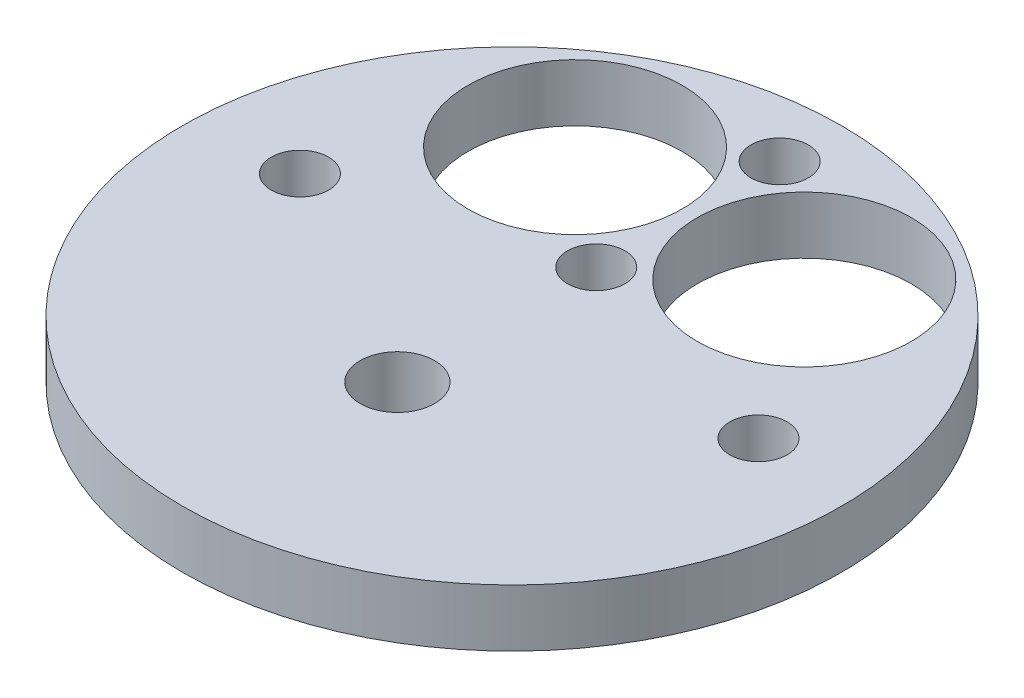
ISO-10303-21;
HEADER;
FILE_DESCRIPTION(('STEP AP214'),'2;1');
FILE_NAME('part.step','',(''),(''),'','','');
FILE_SCHEMA(('AUTOMOTIVE_DESIGN { 1 0 10303 214 1 1 1 1 }'));
ENDSEC;
DATA;
#1=APPLICATION_CONTEXT('core data for automotive mechanical design processes');
#2=APPLICATION_PROTOCOL_DEFINITION('international standard','automotive_design',2000,#1);
#3=PRODUCT_CONTEXT('',#1,'mechanical');
#4=PRODUCT('Part','Part','',(#3));
#5=PRODUCT_RELATED_PRODUCT_CATEGORY('part','',(#4));
#6=PRODUCT_DEFINITION_FORMATION('','',#4);
#7=PRODUCT_DEFINITION_CONTEXT('part definition',#1,'design');
#8=PRODUCT_DEFINITION('design','',#6,#7);
#9=PRODUCT_DEFINITION_SHAPE('','',#8);
#10=(LENGTH_UNIT() NAMED_UNIT(*) SI_UNIT(.MILLI.,.METRE.));
#11=(NAMED_UNIT(*) PLANE_ANGLE_UNIT() SI_UNIT($,.RADIAN.));
#12=(NAMED_UNIT(*) SI_UNIT($,.STERADIAN.) SOLID_ANGLE_UNIT());
#13=UNCERTAINTY_MEASURE_WITH_UNIT(LENGTH_MEASURE(1.E-05),#10,'distance_accuracy_value','');
#14=(GEOMETRIC_REPRESENTATION_CONTEXT(3) GLOBAL_UNCERTAINTY_ASSIGNED_CONTEXT((#13)) GLOBAL_UNIT_ASSIGNED_CONTEXT((#10,
#11,#12)) REPRESENTATION_CONTEXT('',''));
#15=CARTESIAN_POINT('',(0.,0.,0.));
#16=DIRECTION('',(0.,0.,1.));
#17=DIRECTION('',(1.,0.,0.));
#18=AXIS2_PLACEMENT_3D('',#15,#16,#17);
#19=CARTESIAN_POINT('',(0.,6.35,0.));
#20=DIRECTION('',(0.,-1.,0.));
#21=DIRECTION('',(0.,0.,-1.));
#22=AXIS2_PLACEMENT_3D('',#19,#20,#21);
#23=CYLINDRICAL_SURFACE('',#22,36.5125);
#24=CARTESIAN_POINT('',(0.,6.35,0.));
#25=DIRECTION('',(0.,1.,0.));
#26=DIRECTION('',(0.,0.,1.));
#27=AXIS2_PLACEMENT_3D('',#24,#25,#26);
#28=CIRCLE('',#27,36.5125);
#29=CARTESIAN_POINT('',(0.,6.35,36.5125));
#30=VERTEX_POINT('',#29);
#31=EDGE_CURVE('E10',#30,#30,#28,.T.);
#32=ORIENTED_EDGE('',*,*,#31,.F.);
#33=EDGE_LOOP('',(#32));
#34=FACE_BOUND('',#33,.T.);
#35=CARTESIAN_POINT('',(0.,0.,0.));
#36=DIRECTION('',(0.,1.,0.));
#37=DIRECTION('',(0.,0.,1.));
#38=AXIS2_PLACEMENT_3D('',#35,#36,#37);
#39=CIRCLE('',#38,36.5125);
#40=CARTESIAN_POINT('',(0.,0.,36.5125));
#41=VERTEX_POINT('',#40);
#42=EDGE_CURVE('E44',#41,#41,#39,.T.);
#43=ORIENTED_EDGE('',*,*,#42,.T.);
#44=EDGE_LOOP('',(#43));
#45=FACE_BOUND('',#44,.T.);
#46=ADVANCED_FACE('F37',(#34,#45),#23,.T.);
#47=CARTESIAN_POINT('',(0.,6.35,0.));
#48=DIRECTION('',(0.,1.,0.));
#49=DIRECTION('',(0.,0.,1.));
#50=AXIS2_PLACEMENT_3D('',#47,#48,#49);
#51=PLANE('',#50);
#52=CARTESIAN_POINT('',(0.,6.35,12.7));
#53=DIRECTION('',(0.,1.,0.));
#54=DIRECTION('',(0.,0.,1.));
#55=AXIS2_PLACEMENT_3D('',#52,#53,#54);
#56=CIRCLE('',#55,4.1275);
#57=CARTESIAN_POINT('',(0.,6.35,16.8275));
#58=VERTEX_POINT('',#57);
#59=EDGE_CURVE('E81',#58,#58,#56,.T.);
#60=ORIENTED_EDGE('',*,*,#59,.F.);
#61=EDGE_LOOP('',(#60));
#62=FACE_BOUND('',#61,.T.);
#63=CARTESIAN_POINT('',(25.4,6.35,-1.905));
#64=DIRECTION('',(0.,1.,0.));
#65=DIRECTION('',(0.,0.,1.));
#66=AXIS2_PLACEMENT_3D('',#63,#64,#65);
#67=CIRCLE('',#66,3.175);
#68=CARTESIAN_POINT('',(25.4,6.35,1.27));
#69=VERTEX_POINT('',#68);
#70=EDGE_CURVE('E67',#69,#69,#67,.T.);
#71=ORIENTED_EDGE('',*,*,#70,.F.);
#72=EDGE_LOOP('',(#71));
#73=FACE_BOUND('',#72,.T.);
#74=CARTESIAN_POINT('',(-25.4,6.35,-1.905));
#75=DIRECTION('',(0.,1.,0.));
#76=DIRECTION('',(0.,0.,-1.));
#77=AXIS2_PLACEMENT_3D('',#74,#75,#76);
#78=CIRCLE('',#77,3.175);
#79=CARTESIAN_POINT('',(-25.4,6.35,-5.08));
#80=VERTEX_POINT('',#79);
#81=EDGE_CURVE('E73',#80,#80,#78,.T.);
#82=ORIENTED_EDGE('',*,*,#81,.F.);
#83=EDGE_LOOP('',(#82));
#84=FACE_BOUND('',#83,.T.);
#85=CARTESIAN_POINT('',(0.,6.35,-29.6540115119919));
#86=DIRECTION('',(0.,1.,0.));
#87=DIRECTION('',(0.,0.,1.));
#88=AXIS2_PLACEMENT_3D('',#85,#86,#87);
#89=CIRCLE('',#88,3.175);
#90=CARTESIAN_POINT('',(0.,6.35,-26.4790115119919));
#91=VERTEX_POINT('',#90);
#92=EDGE_CURVE('E86',#91,#91,#89,.T.);
#93=ORIENTED_EDGE('',*,*,#92,.F.);
#94=EDGE_LOOP('',(#93));
#95=FACE_BOUND('',#94,.T.);
#96=CARTESIAN_POINT('',(12.7,6.35,-19.685));
#97=DIRECTION('',(0.,1.,0.));
#98=DIRECTION('',(0.,0.,1.));
#99=AXIS2_PLACEMENT_3D('',#96,#97,#98);
#100=CIRCLE('',#99,11.8745);
#101=CARTESIAN_POINT('',(12.7,6.35,-7.8105));
#102=VERTEX_POINT('',#101);
#103=EDGE_CURVE('E88',#102,#102,#100,.T.);
#104=ORIENTED_EDGE('',*,*,#103,.F.);
#105=EDGE_LOOP('',(#104));
#106=FACE_BOUND('',#105,.T.);
#107=CARTESIAN_POINT('',(0.,6.35,-9.33401151199186));
#108=DIRECTION('',(0.,1.,0.));
#109=DIRECTION('',(0.,0.,1.));
#110=AXIS2_PLACEMENT_3D('',#107,#108,#109);
#111=CIRCLE('',#110,3.175);
#112=CARTESIAN_POINT('',(0.,6.35,-6.15901151199185));
#113=VERTEX_POINT('',#112);
#114=EDGE_CURVE('E71',#113,#113,#111,.T.);
#115=ORIENTED_EDGE('',*,*,#114,.F.);
#116=EDGE_LOOP('',(#115));
#117=FACE_BOUND('',#116,.T.);
#118=CARTESIAN_POINT('',(-12.7,6.35,-19.685));
#119=DIRECTION('',(0.,1.,0.));
#120=DIRECTION('',(0.,0.,1.));
#121=AXIS2_PLACEMENT_3D('',#118,#119,#120);
#122=CIRCLE('',#121,11.8745);
#123=CARTESIAN_POINT('',(-12.7,6.35,-7.8105));
#124=VERTEX_POINT('',#123);
#125=EDGE_CURVE('E52',#124,#124,#122,.T.);
#126=ORIENTED_EDGE('',*,*,#125,.F.);
#127=EDGE_LOOP('',(#126));
#128=FACE_BOUND('',#127,.T.);
#129=ORIENTED_EDGE('',*,*,#31,.T.);
#130=EDGE_LOOP('',(#129));
#131=FACE_BOUND('',#130,.T.);
#132=ADVANCED_FACE('F98',(#62,#73,#84,#95,#106,#117,#128,#131),#51,.T.);
#133=CARTESIAN_POINT('',(0.,0.,0.));
#134=DIRECTION('',(0.,1.,0.));
#135=DIRECTION('',(0.,0.,1.));
#136=AXIS2_PLACEMENT_3D('',#133,#134,#135);
#137=PLANE('',#136);
#138=CARTESIAN_POINT('',(0.,0.,12.7));
#139=DIRECTION('',(0.,1.,0.));
#140=DIRECTION('',(0.,0.,1.));
#141=AXIS2_PLACEMENT_3D('',#138,#139,#140);
#142=CIRCLE('',#141,4.1275);
#143=CARTESIAN_POINT('',(0.,0.,16.8275));
#144=VERTEX_POINT('',#143);
#145=EDGE_CURVE('E78',#144,#144,#142,.T.);
#146=ORIENTED_EDGE('',*,*,#145,.T.);
#147=EDGE_LOOP('',(#146));
#148=FACE_BOUND('',#147,.T.);
#149=CARTESIAN_POINT('',(25.4,0.,-1.905));
#150=DIRECTION('',(0.,1.,0.));
#151=DIRECTION('',(0.,0.,1.));
#152=AXIS2_PLACEMENT_3D('',#149,#150,#151);
#153=CIRCLE('',#152,3.175);
#154=CARTESIAN_POINT('',(25.4,0.,1.27));
#155=VERTEX_POINT('',#154);
#156=EDGE_CURVE('E40',#155,#155,#153,.T.);
#157=ORIENTED_EDGE('',*,*,#156,.T.);
#158=EDGE_LOOP('',(#157));
#159=FACE_BOUND('',#158,.T.);
#160=CARTESIAN_POINT('',(-25.4,0.,-1.905));
#161=DIRECTION('',(0.,1.,0.));
#162=DIRECTION('',(0.,0.,1.));
#163=AXIS2_PLACEMENT_3D('',#160,#161,#162);
#164=CIRCLE('',#163,3.175);
#165=CARTESIAN_POINT('',(-25.4,0.,1.27));
#166=VERTEX_POINT('',#165);
#167=EDGE_CURVE('E65',#166,#166,#164,.T.);
#168=ORIENTED_EDGE('',*,*,#167,.T.);
#169=EDGE_LOOP('',(#168));
#170=FACE_BOUND('',#169,.T.);
#171=CARTESIAN_POINT('',(0.,0.,-29.6540115119919));
#172=DIRECTION('',(0.,1.,0.));
#173=DIRECTION('',(0.,0.,1.));
#174=AXIS2_PLACEMENT_3D('',#171,#172,#173);
#175=CIRCLE('',#174,3.175);
#176=CARTESIAN_POINT('',(0.,0.,-26.4790115119919));
#177=VERTEX_POINT('',#176);
#178=EDGE_CURVE('E49',#177,#177,#175,.T.);
#179=ORIENTED_EDGE('',*,*,#178,.T.);
#180=EDGE_LOOP('',(#179));
#181=FACE_BOUND('',#180,.T.);
#182=CARTESIAN_POINT('',(12.7,0.,-19.685));
#183=DIRECTION('',(0.,1.,0.));
#184=DIRECTION('',(0.,0.,1.));
#185=AXIS2_PLACEMENT_3D('',#182,#183,#184);
#186=CIRCLE('',#185,11.8745);
#187=CARTESIAN_POINT('',(12.7,0.,-7.8105));
#188=VERTEX_POINT('',#187);
#189=EDGE_CURVE('E61',#188,#188,#186,.T.);
#190=ORIENTED_EDGE('',*,*,#189,.T.);
#191=EDGE_LOOP('',(#190));
#192=FACE_BOUND('',#191,.T.);
#193=CARTESIAN_POINT('',(0.,0.,-9.33401151199186));
#194=DIRECTION('',(0.,1.,0.));
#195=DIRECTION('',(0.,0.,1.));
#196=AXIS2_PLACEMENT_3D('',#193,#194,#195);
#197=CIRCLE('',#196,3.175);
#198=CARTESIAN_POINT('',(0.,0.,-6.15901151199185));
#199=VERTEX_POINT('',#198);
#200=EDGE_CURVE('E58',#199,#199,#197,.T.);
#201=ORIENTED_EDGE('',*,*,#200,.T.);
#202=EDGE_LOOP('',(#201));
#203=FACE_BOUND('',#202,.T.);
#204=CARTESIAN_POINT('',(-12.7,0.,-19.685));
#205=DIRECTION('',(0.,1.,0.));
#206=DIRECTION('',(0.,0.,1.));
#207=AXIS2_PLACEMENT_3D('',#204,#205,#206);
#208=CIRCLE('',#207,11.8745);
#209=CARTESIAN_POINT('',(-12.7,0.,-7.8105));
#210=VERTEX_POINT('',#209);
#211=EDGE_CURVE('E55',#210,#210,#208,.T.);
#212=ORIENTED_EDGE('',*,*,#211,.T.);
#213=EDGE_LOOP('',(#212));
#214=FACE_BOUND('',#213,.T.);
#215=ORIENTED_EDGE('',*,*,#42,.F.);
#216=EDGE_LOOP('',(#215));
#217=FACE_BOUND('',#216,.T.);
#218=ADVANCED_FACE('F100',(#148,#159,#170,#181,#192,#203,#214,#217),#137,.F.);
#219=CARTESIAN_POINT('',(-12.7,-10.414,-19.685));
#220=DIRECTION('',(0.,1.,0.));
#221=DIRECTION('',(0.,0.,1.));
#222=AXIS2_PLACEMENT_3D('',#219,#220,#221);
#223=CYLINDRICAL_SURFACE('',#222,11.8745);
#224=ORIENTED_EDGE('',*,*,#125,.T.);
#225=EDGE_LOOP('',(#224));
#226=FACE_BOUND('',#225,.T.);
#227=ORIENTED_EDGE('',*,*,#211,.F.);
#228=EDGE_LOOP('',(#227));
#229=FACE_BOUND('',#228,.T.);
#230=ADVANCED_FACE('F95',(#226,#229),#223,.F.);
#231=CARTESIAN_POINT('',(0.,-10.414,-9.33401151199186));
#232=DIRECTION('',(0.,1.,0.));
#233=DIRECTION('',(0.,0.,1.));
#234=AXIS2_PLACEMENT_3D('',#231,#232,#233);
#235=CYLINDRICAL_SURFACE('',#234,3.175);
#236=ORIENTED_EDGE('',*,*,#114,.T.);
#237=EDGE_LOOP('',(#236));
#238=FACE_BOUND('',#237,.T.);
#239=ORIENTED_EDGE('',*,*,#200,.F.);
#240=EDGE_LOOP('',(#239));
#241=FACE_BOUND('',#240,.T.);
#242=ADVANCED_FACE('F115',(#238,#241),#235,.F.);
#243=CARTESIAN_POINT('',(12.7,-10.414,-19.685));
#244=DIRECTION('',(0.,1.,0.));
#245=DIRECTION('',(0.,0.,1.));
#246=AXIS2_PLACEMENT_3D('',#243,#244,#245);
#247=CYLINDRICAL_SURFACE('',#246,11.8745);
#248=ORIENTED_EDGE('',*,*,#103,.T.);
#249=EDGE_LOOP('',(#248));
#250=FACE_BOUND('',#249,.T.);
#251=ORIENTED_EDGE('',*,*,#189,.F.);
#252=EDGE_LOOP('',(#251));
#253=FACE_BOUND('',#252,.T.);
#254=ADVANCED_FACE('F116',(#250,#253),#247,.F.);
#255=CARTESIAN_POINT('',(0.,-10.414,-29.6540115119919));
#256=DIRECTION('',(0.,1.,0.));
#257=DIRECTION('',(0.,0.,1.));
#258=AXIS2_PLACEMENT_3D('',#255,#256,#257);
#259=CYLINDRICAL_SURFACE('',#258,3.175);
#260=ORIENTED_EDGE('',*,*,#92,.T.);
#261=EDGE_LOOP('',(#260));
#262=FACE_BOUND('',#261,.T.);
#263=ORIENTED_EDGE('',*,*,#178,.F.);
#264=EDGE_LOOP('',(#263));
#265=FACE_BOUND('',#264,.T.);
#266=ADVANCED_FACE('F119',(#262,#265),#259,.F.);
#267=CARTESIAN_POINT('',(-25.4,-10.414,-1.905));
#268=DIRECTION('',(0.,1.,0.));
#269=DIRECTION('',(0.,0.,1.));
#270=AXIS2_PLACEMENT_3D('',#267,#268,#269);
#271=CYLINDRICAL_SURFACE('',#270,3.175);
#272=ORIENTED_EDGE('',*,*,#81,.T.);
#273=EDGE_LOOP('',(#272));
#274=FACE_BOUND('',#273,.T.);
#275=ORIENTED_EDGE('',*,*,#167,.F.);
#276=EDGE_LOOP('',(#275));
#277=FACE_BOUND('',#276,.T.);
#278=ADVANCED_FACE('F122',(#274,#277),#271,.F.);
#279=CARTESIAN_POINT('',(25.4,-10.414,-1.905));
#280=DIRECTION('',(0.,1.,0.));
#281=DIRECTION('',(0.,0.,1.));
#282=AXIS2_PLACEMENT_3D('',#279,#280,#281);
#283=CYLINDRICAL_SURFACE('',#282,3.175);
#284=ORIENTED_EDGE('',*,*,#70,.T.);
#285=EDGE_LOOP('',(#284));
#286=FACE_BOUND('',#285,.T.);
#287=ORIENTED_EDGE('',*,*,#156,.F.);
#288=EDGE_LOOP('',(#287));
#289=FACE_BOUND('',#288,.T.);
#290=ADVANCED_FACE('F129',(#286,#289),#283,.F.);
#291=CARTESIAN_POINT('',(0.,0.,12.7));
#292=DIRECTION('',(0.,1.,0.));
#293=DIRECTION('',(0.,0.,1.));
#294=AXIS2_PLACEMENT_3D('',#291,#292,#293);
#295=CYLINDRICAL_SURFACE('',#294,4.1275);
#296=ORIENTED_EDGE('',*,*,#145,.F.);
#297=EDGE_LOOP('',(#296));
#298=FACE_BOUND('',#297,.T.);
#299=ORIENTED_EDGE('',*,*,#59,.T.);
#300=EDGE_LOOP('',(#299));
#301=FACE_BOUND('',#300,.T.);
#302=ADVANCED_FACE('F133',(#298,#301),#295,.F.);
#303=CLOSED_SHELL('',(#46,#132,#218,#230,#242,#254,#266,#278,#290,#302));
#304=MANIFOLD_SOLID_BREP('B2',#303);
#305=ADVANCED_BREP_SHAPE_REPRESENTATION('',(#18,#304),#14);
#306=SHAPE_DEFINITION_REPRESENTATION(#9,#305);
ENDSEC;
END-ISO-10303-21;
